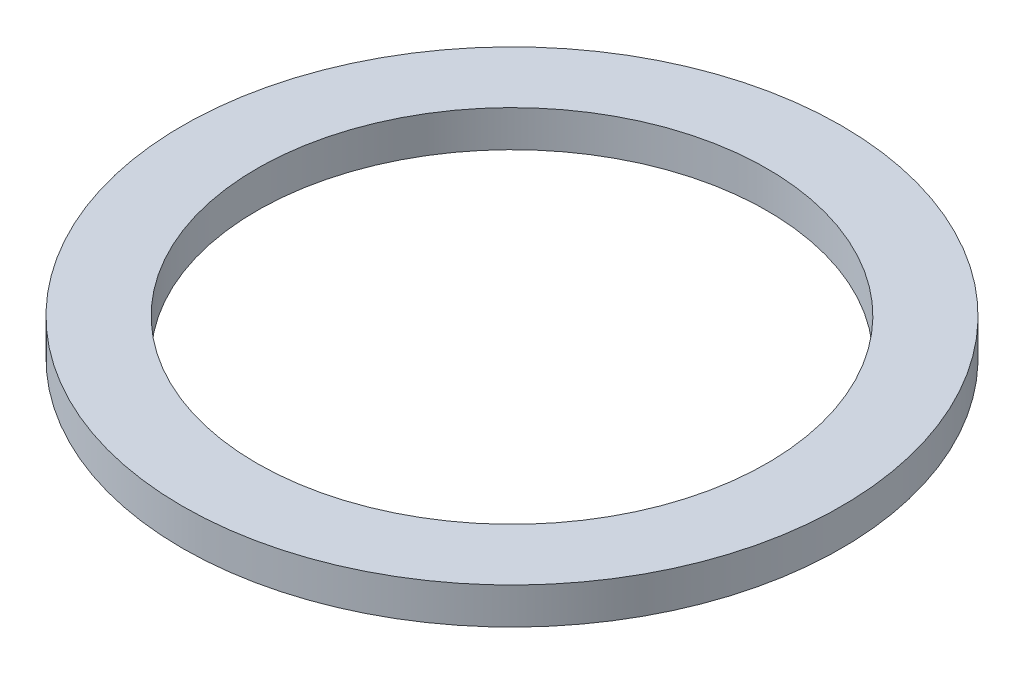
ISO-10303-21;
HEADER;
FILE_DESCRIPTION(('STEP AP214'),'2;1');
FILE_NAME('part.step','',(''),(''),'','','');
FILE_SCHEMA(('AUTOMOTIVE_DESIGN { 1 0 10303 214 1 1 1 1 }'));
ENDSEC;
DATA;
#1=APPLICATION_CONTEXT('core data for automotive mechanical design processes');
#2=APPLICATION_PROTOCOL_DEFINITION('international standard','automotive_design',2000,#1);
#3=PRODUCT_CONTEXT('',#1,'mechanical');
#4=PRODUCT('Part','Part','',(#3));
#5=PRODUCT_RELATED_PRODUCT_CATEGORY('part','',(#4));
#6=PRODUCT_DEFINITION_FORMATION('','',#4);
#7=PRODUCT_DEFINITION_CONTEXT('part definition',#1,'design');
#8=PRODUCT_DEFINITION('design','',#6,#7);
#9=PRODUCT_DEFINITION_SHAPE('','',#8);
#10=(LENGTH_UNIT() NAMED_UNIT(*) SI_UNIT(.MILLI.,.METRE.));
#11=(NAMED_UNIT(*) PLANE_ANGLE_UNIT() SI_UNIT($,.RADIAN.));
#12=(NAMED_UNIT(*) SI_UNIT($,.STERADIAN.) SOLID_ANGLE_UNIT());
#13=UNCERTAINTY_MEASURE_WITH_UNIT(LENGTH_MEASURE(1.E-05),#10,'distance_accuracy_value','');
#14=(GEOMETRIC_REPRESENTATION_CONTEXT(3) GLOBAL_UNCERTAINTY_ASSIGNED_CONTEXT((#13)) GLOBAL_UNIT_ASSIGNED_CONTEXT((#10,
#11,#12)) REPRESENTATION_CONTEXT('',''));
#15=CARTESIAN_POINT('',(0.,0.,0.));
#16=DIRECTION('',(0.,0.,1.));
#17=DIRECTION('',(1.,0.,0.));
#18=AXIS2_PLACEMENT_3D('',#15,#16,#17);
#19=CARTESIAN_POINT('',(0.,1.5875,0.));
#20=DIRECTION('',(0.,-1.,0.));
#21=DIRECTION('',(0.,0.,-1.));
#22=AXIS2_PLACEMENT_3D('',#19,#20,#21);
#23=CYLINDRICAL_SURFACE('',#22,14.351);
#24=CARTESIAN_POINT('',(0.,1.5875,0.));
#25=DIRECTION('',(0.,1.,0.));
#26=DIRECTION('',(0.,0.,1.));
#27=AXIS2_PLACEMENT_3D('',#24,#25,#26);
#28=CIRCLE('',#27,14.351);
#29=CARTESIAN_POINT('',(0.,1.5875,14.351));
#30=VERTEX_POINT('',#29);
#31=EDGE_CURVE('E10',#30,#30,#28,.T.);
#32=ORIENTED_EDGE('',*,*,#31,.F.);
#33=EDGE_LOOP('',(#32));
#34=FACE_BOUND('',#33,.T.);
#35=CARTESIAN_POINT('',(0.,0.,0.));
#36=DIRECTION('',(0.,1.,0.));
#37=DIRECTION('',(0.,0.,1.));
#38=AXIS2_PLACEMENT_3D('',#35,#36,#37);
#39=CIRCLE('',#38,14.351);
#40=CARTESIAN_POINT('',(0.,0.,14.351));
#41=VERTEX_POINT('',#40);
#42=EDGE_CURVE('E34',#41,#41,#39,.T.);
#43=ORIENTED_EDGE('',*,*,#42,.T.);
#44=EDGE_LOOP('',(#43));
#45=FACE_BOUND('',#44,.T.);
#46=ADVANCED_FACE('F31',(#34,#45),#23,.T.);
#47=CARTESIAN_POINT('',(0.,1.5875,0.));
#48=DIRECTION('',(0.,1.,0.));
#49=DIRECTION('',(0.,0.,1.));
#50=AXIS2_PLACEMENT_3D('',#47,#48,#49);
#51=PLANE('',#50);
#52=CARTESIAN_POINT('',(0.,1.5875,0.));
#53=DIRECTION('',(0.,1.,0.));
#54=DIRECTION('',(0.,0.,1.));
#55=AXIS2_PLACEMENT_3D('',#52,#53,#54);
#56=CIRCLE('',#55,11.1125);
#57=CARTESIAN_POINT('',(0.,1.5875,11.1125));
#58=VERTEX_POINT('',#57);
#59=EDGE_CURVE('E43',#58,#58,#56,.T.);
#60=ORIENTED_EDGE('',*,*,#59,.F.);
#61=EDGE_LOOP('',(#60));
#62=FACE_BOUND('',#61,.T.);
#63=ORIENTED_EDGE('',*,*,#31,.T.);
#64=EDGE_LOOP('',(#63));
#65=FACE_BOUND('',#64,.T.);
#66=ADVANCED_FACE('F58',(#62,#65),#51,.T.);
#67=CARTESIAN_POINT('',(0.,0.,0.));
#68=DIRECTION('',(0.,1.,0.));
#69=DIRECTION('',(0.,0.,1.));
#70=AXIS2_PLACEMENT_3D('',#67,#68,#69);
#71=PLANE('',#70);
#72=CARTESIAN_POINT('',(0.,0.,0.));
#73=DIRECTION('',(0.,1.,0.));
#74=DIRECTION('',(0.,0.,1.));
#75=AXIS2_PLACEMENT_3D('',#72,#73,#74);
#76=CIRCLE('',#75,11.1125);
#77=CARTESIAN_POINT('',(0.,0.,11.1125));
#78=VERTEX_POINT('',#77);
#79=EDGE_CURVE('E41',#78,#78,#76,.T.);
#80=ORIENTED_EDGE('',*,*,#79,.T.);
#81=EDGE_LOOP('',(#80));
#82=FACE_BOUND('',#81,.T.);
#83=ORIENTED_EDGE('',*,*,#42,.F.);
#84=EDGE_LOOP('',(#83));
#85=FACE_BOUND('',#84,.T.);
#86=ADVANCED_FACE('F49',(#82,#85),#71,.F.);
#87=CARTESIAN_POINT('',(0.,0.,0.));
#88=DIRECTION('',(0.,1.,0.));
#89=DIRECTION('',(0.,0.,1.));
#90=AXIS2_PLACEMENT_3D('',#87,#88,#89);
#91=CYLINDRICAL_SURFACE('',#90,11.1125);
#92=ORIENTED_EDGE('',*,*,#79,.F.);
#93=EDGE_LOOP('',(#92));
#94=FACE_BOUND('',#93,.T.);
#95=ORIENTED_EDGE('',*,*,#59,.T.);
#96=EDGE_LOOP('',(#95));
#97=FACE_BOUND('',#96,.T.);
#98=ADVANCED_FACE('F52',(#94,#97),#91,.F.);
#99=CLOSED_SHELL('',(#46,#66,#86,#98));
#100=MANIFOLD_SOLID_BREP('B2',#99);
#101=ADVANCED_BREP_SHAPE_REPRESENTATION('',(#18,#100),#14);
#102=SHAPE_DEFINITION_REPRESENTATION(#9,#101);
ENDSEC;
END-ISO-10303-21;
